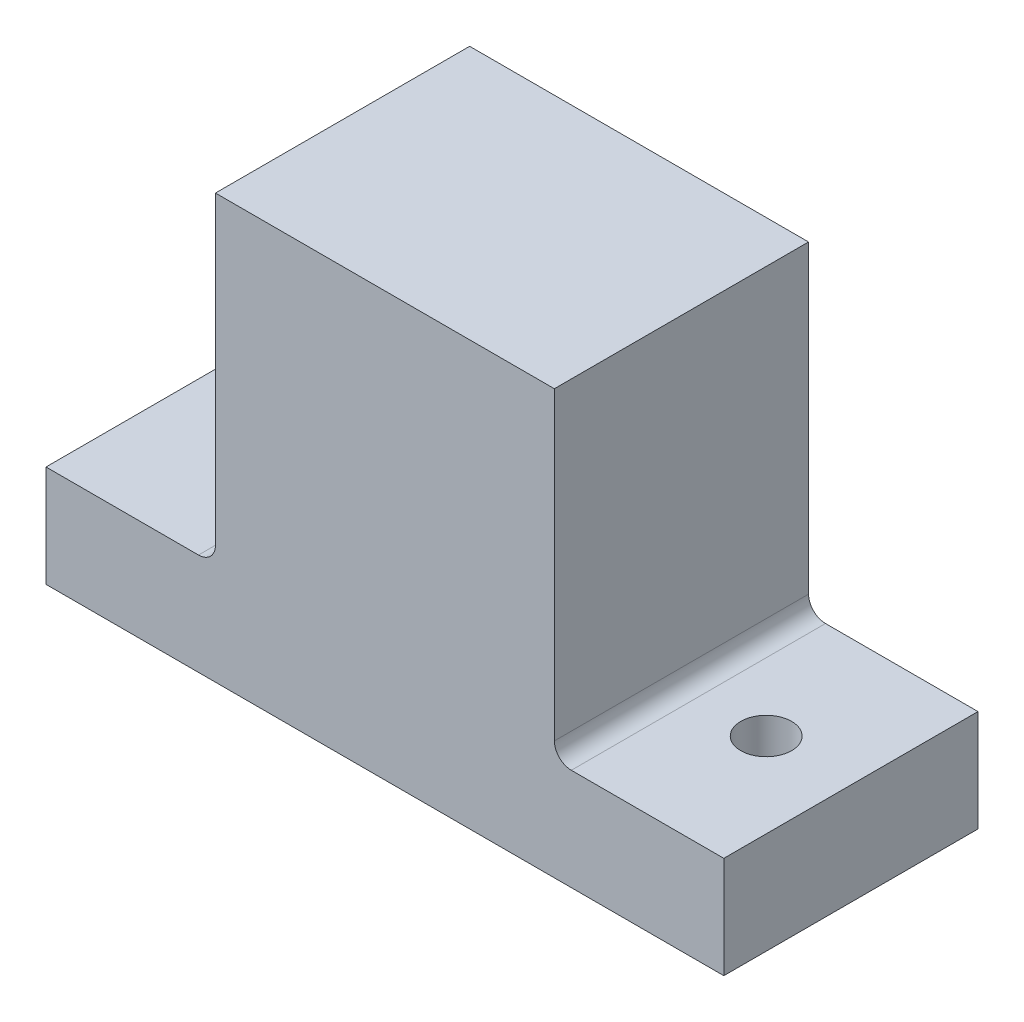
ISO-10303-21;
HEADER;
FILE_DESCRIPTION(('STEP AP214'),'2;1');
FILE_NAME('part.step','',(''),(''),'','','');
FILE_SCHEMA(('AUTOMOTIVE_DESIGN { 1 0 10303 214 1 1 1 1 }'));
ENDSEC;
DATA;
#1=APPLICATION_CONTEXT('core data for automotive mechanical design processes');
#2=APPLICATION_PROTOCOL_DEFINITION('international standard','automotive_design',2000,#1);
#3=PRODUCT_CONTEXT('',#1,'mechanical');
#4=PRODUCT('Part','Part','',(#3));
#5=PRODUCT_RELATED_PRODUCT_CATEGORY('part','',(#4));
#6=PRODUCT_DEFINITION_FORMATION('','',#4);
#7=PRODUCT_DEFINITION_CONTEXT('part definition',#1,'design');
#8=PRODUCT_DEFINITION('design','',#6,#7);
#9=PRODUCT_DEFINITION_SHAPE('','',#8);
#10=(LENGTH_UNIT() NAMED_UNIT(*) SI_UNIT(.MILLI.,.METRE.));
#11=(NAMED_UNIT(*) PLANE_ANGLE_UNIT() SI_UNIT($,.RADIAN.));
#12=(NAMED_UNIT(*) SI_UNIT($,.STERADIAN.) SOLID_ANGLE_UNIT());
#13=UNCERTAINTY_MEASURE_WITH_UNIT(LENGTH_MEASURE(1.E-05),#10,'distance_accuracy_value','');
#14=(GEOMETRIC_REPRESENTATION_CONTEXT(3) GLOBAL_UNCERTAINTY_ASSIGNED_CONTEXT((#13)) GLOBAL_UNIT_ASSIGNED_CONTEXT((#10,
#11,#12)) REPRESENTATION_CONTEXT('',''));
#15=CARTESIAN_POINT('',(0.,0.,0.));
#16=DIRECTION('',(0.,0.,1.));
#17=DIRECTION('',(1.,0.,0.));
#18=AXIS2_PLACEMENT_3D('',#15,#16,#17);
#19=CARTESIAN_POINT('',(-20.,0.,15.));
#20=DIRECTION('',(1.,0.,0.));
#21=DIRECTION('',(0.,0.,-1.));
#22=AXIS2_PLACEMENT_3D('',#19,#20,#21);
#23=PLANE('',#22);
#24=DIRECTION('',(0.,-1.,0.));
#25=VECTOR('',#24,1.);
#26=CARTESIAN_POINT('',(-20.,0.,0.));
#27=LINE('',#26,#25);
#28=CARTESIAN_POINT('',(-20.,6.,0.));
#29=VERTEX_POINT('',#28);
#30=CARTESIAN_POINT('',(-20.,0.,0.));
#31=VERTEX_POINT('',#30);
#32=EDGE_CURVE('E142',#29,#31,#27,.T.);
#33=ORIENTED_EDGE('',*,*,#32,.T.);
#34=DIRECTION('',(0.,0.,-1.));
#35=VECTOR('',#34,1.);
#36=CARTESIAN_POINT('',(-20.,0.,15.));
#37=LINE('',#36,#35);
#38=CARTESIAN_POINT('',(-20.,0.,15.));
#39=VERTEX_POINT('',#38);
#40=EDGE_CURVE('E121',#39,#31,#37,.T.);
#41=ORIENTED_EDGE('',*,*,#40,.F.);
#42=DIRECTION('',(0.,-1.,0.));
#43=VECTOR('',#42,1.);
#44=CARTESIAN_POINT('',(-20.,0.,15.));
#45=LINE('',#44,#43);
#46=CARTESIAN_POINT('',(-20.,6.,15.));
#47=VERTEX_POINT('',#46);
#48=EDGE_CURVE('E129',#47,#39,#45,.T.);
#49=ORIENTED_EDGE('',*,*,#48,.F.);
#50=DIRECTION('',(0.,0.,-1.));
#51=VECTOR('',#50,1.);
#52=CARTESIAN_POINT('',(-20.,6.,15.));
#53=LINE('',#52,#51);
#54=EDGE_CURVE('E218',#47,#29,#53,.T.);
#55=ORIENTED_EDGE('',*,*,#54,.T.);
#56=EDGE_LOOP('',(#33,#41,#49,#55));
#57=FACE_BOUND('',#56,.T.);
#58=ADVANCED_FACE('F39',(#57),#23,.F.);
#59=CARTESIAN_POINT('',(20.,0.,15.));
#60=DIRECTION('',(0.,1.,0.));
#61=DIRECTION('',(0.,0.,1.));
#62=AXIS2_PLACEMENT_3D('',#59,#60,#61);
#63=PLANE('',#62);
#64=CARTESIAN_POINT('',(-15.,0.,7.50000000000001));
#65=DIRECTION('',(0.,1.,0.));
#66=DIRECTION('',(-1.,0.,0.));
#67=AXIS2_PLACEMENT_3D('',#64,#65,#66);
#68=CIRCLE('',#67,1.5);
#69=CARTESIAN_POINT('',(-16.5,0.,7.50000000000001));
#70=VERTEX_POINT('',#69);
#71=EDGE_CURVE('E240',#70,#70,#68,.T.);
#72=ORIENTED_EDGE('',*,*,#71,.T.);
#73=EDGE_LOOP('',(#72));
#74=FACE_BOUND('',#73,.T.);
#75=CARTESIAN_POINT('',(15.,0.,7.50000000000001));
#76=DIRECTION('',(0.,1.,0.));
#77=DIRECTION('',(1.,0.,0.));
#78=AXIS2_PLACEMENT_3D('',#75,#76,#77);
#79=CIRCLE('',#78,1.5);
#80=CARTESIAN_POINT('',(16.5,0.,7.50000000000001));
#81=VERTEX_POINT('',#80);
#82=EDGE_CURVE('E377',#81,#81,#79,.T.);
#83=ORIENTED_EDGE('',*,*,#82,.T.);
#84=EDGE_LOOP('',(#83));
#85=FACE_BOUND('',#84,.T.);
#86=DIRECTION('',(1.,0.,0.));
#87=VECTOR('',#86,1.);
#88=CARTESIAN_POINT('',(20.,0.,0.));
#89=LINE('',#88,#87);
#90=CARTESIAN_POINT('',(20.,0.,0.));
#91=VERTEX_POINT('',#90);
#92=EDGE_CURVE('E207',#31,#91,#89,.T.);
#93=ORIENTED_EDGE('',*,*,#92,.T.);
#94=DIRECTION('',(0.,0.,-1.));
#95=VECTOR('',#94,1.);
#96=CARTESIAN_POINT('',(20.,0.,15.));
#97=LINE('',#96,#95);
#98=CARTESIAN_POINT('',(20.,0.,15.));
#99=VERTEX_POINT('',#98);
#100=EDGE_CURVE('E124',#99,#91,#97,.T.);
#101=ORIENTED_EDGE('',*,*,#100,.F.);
#102=DIRECTION('',(1.,0.,0.));
#103=VECTOR('',#102,1.);
#104=CARTESIAN_POINT('',(20.,0.,15.));
#105=LINE('',#104,#103);
#106=EDGE_CURVE('E117',#39,#99,#105,.T.);
#107=ORIENTED_EDGE('',*,*,#106,.F.);
#108=ORIENTED_EDGE('',*,*,#40,.T.);
#109=EDGE_LOOP('',(#93,#101,#107,#108));
#110=FACE_BOUND('',#109,.T.);
#111=ADVANCED_FACE('F119',(#74,#85,#110),#63,.F.);
#112=CARTESIAN_POINT('',(20.,0.,15.));
#113=DIRECTION('',(-1.,0.,0.));
#114=DIRECTION('',(0.,0.,1.));
#115=AXIS2_PLACEMENT_3D('',#112,#113,#114);
#116=PLANE('',#115);
#117=DIRECTION('',(0.,1.,0.));
#118=VECTOR('',#117,1.);
#119=CARTESIAN_POINT('',(20.,0.,0.));
#120=LINE('',#119,#118);
#121=CARTESIAN_POINT('',(20.,6.,0.));
#122=VERTEX_POINT('',#121);
#123=EDGE_CURVE('E201',#91,#122,#120,.T.);
#124=ORIENTED_EDGE('',*,*,#123,.T.);
#125=DIRECTION('',(0.,0.,-1.));
#126=VECTOR('',#125,1.);
#127=CARTESIAN_POINT('',(20.,6.,15.));
#128=LINE('',#127,#126);
#129=CARTESIAN_POINT('',(20.,6.,15.));
#130=VERTEX_POINT('',#129);
#131=EDGE_CURVE('E151',#130,#122,#128,.T.);
#132=ORIENTED_EDGE('',*,*,#131,.F.);
#133=DIRECTION('',(0.,1.,0.));
#134=VECTOR('',#133,1.);
#135=CARTESIAN_POINT('',(20.,0.,15.));
#136=LINE('',#135,#134);
#137=EDGE_CURVE('E128',#99,#130,#136,.T.);
#138=ORIENTED_EDGE('',*,*,#137,.F.);
#139=ORIENTED_EDGE('',*,*,#100,.T.);
#140=EDGE_LOOP('',(#124,#132,#138,#139));
#141=FACE_BOUND('',#140,.T.);
#142=ADVANCED_FACE('F243',(#141),#116,.F.);
#143=CARTESIAN_POINT('',(20.,6.,15.));
#144=DIRECTION('',(0.,-1.,0.));
#145=DIRECTION('',(1.,0.,0.));
#146=AXIS2_PLACEMENT_3D('',#143,#144,#145);
#147=PLANE('',#146);
#148=CARTESIAN_POINT('',(15.,5.99999999999999,7.50000000000001));
#149=DIRECTION('',(0.,1.,0.));
#150=DIRECTION('',(1.,0.,0.));
#151=AXIS2_PLACEMENT_3D('',#148,#149,#150);
#152=CIRCLE('',#151,1.5);
#153=CARTESIAN_POINT('',(16.5,5.99999999999999,7.50000000000001));
#154=VERTEX_POINT('',#153);
#155=EDGE_CURVE('E384',#154,#154,#152,.T.);
#156=ORIENTED_EDGE('',*,*,#155,.F.);
#157=EDGE_LOOP('',(#156));
#158=FACE_BOUND('',#157,.T.);
#159=DIRECTION('',(-1.,0.,0.));
#160=VECTOR('',#159,1.);
#161=CARTESIAN_POINT('',(20.,6.,0.));
#162=LINE('',#161,#160);
#163=CARTESIAN_POINT('',(11.,5.99999999999999,0.));
#164=VERTEX_POINT('',#163);
#165=EDGE_CURVE('E193',#122,#164,#162,.T.);
#166=ORIENTED_EDGE('',*,*,#165,.T.);
#167=DIRECTION('',(0.,0.,-1.));
#168=VECTOR('',#167,1.);
#169=CARTESIAN_POINT('',(11.,5.99999999999999,15.));
#170=LINE('',#169,#168);
#171=CARTESIAN_POINT('',(11.,5.99999999999999,15.));
#172=VERTEX_POINT('',#171);
#173=EDGE_CURVE('E149',#164,#172,#170,.F.);
#174=ORIENTED_EDGE('',*,*,#173,.T.);
#175=DIRECTION('',(-1.,0.,0.));
#176=VECTOR('',#175,1.);
#177=CARTESIAN_POINT('',(20.,6.,15.));
#178=LINE('',#177,#176);
#179=EDGE_CURVE('E175',#130,#172,#178,.T.);
#180=ORIENTED_EDGE('',*,*,#179,.F.);
#181=ORIENTED_EDGE('',*,*,#131,.T.);
#182=EDGE_LOOP('',(#166,#174,#180,#181));
#183=FACE_BOUND('',#182,.T.);
#184=ADVANCED_FACE('F198',(#158,#183),#147,.F.);
#185=CARTESIAN_POINT('',(10.,5.99999999999999,15.));
#186=DIRECTION('',(-1.,0.,0.));
#187=DIRECTION('',(0.,0.,1.));
#188=AXIS2_PLACEMENT_3D('',#185,#186,#187);
#189=PLANE('',#188);
#190=DIRECTION('',(0.,1.,0.));
#191=VECTOR('',#190,1.);
#192=CARTESIAN_POINT('',(10.,5.99999999999999,15.));
#193=LINE('',#192,#191);
#194=CARTESIAN_POINT('',(10.,6.99999999999999,15.));
#195=VERTEX_POINT('',#194);
#196=CARTESIAN_POINT('',(10.,25.,15.));
#197=VERTEX_POINT('',#196);
#198=EDGE_CURVE('E172',#195,#197,#193,.T.);
#199=ORIENTED_EDGE('',*,*,#198,.F.);
#200=DIRECTION('',(0.,0.,-1.));
#201=VECTOR('',#200,1.);
#202=CARTESIAN_POINT('',(10.,6.99999999999999,0.));
#203=LINE('',#202,#201);
#204=CARTESIAN_POINT('',(10.,6.99999999999999,0.));
#205=VERTEX_POINT('',#204);
#206=EDGE_CURVE('E144',#195,#205,#203,.T.);
#207=ORIENTED_EDGE('',*,*,#206,.T.);
#208=DIRECTION('',(0.,1.,0.));
#209=VECTOR('',#208,1.);
#210=CARTESIAN_POINT('',(10.,5.99999999999999,0.));
#211=LINE('',#210,#209);
#212=CARTESIAN_POINT('',(10.,25.,0.));
#213=VERTEX_POINT('',#212);
#214=EDGE_CURVE('E195',#205,#213,#211,.T.);
#215=ORIENTED_EDGE('',*,*,#214,.T.);
#216=DIRECTION('',(0.,0.,-1.));
#217=VECTOR('',#216,1.);
#218=CARTESIAN_POINT('',(10.,25.,15.));
#219=LINE('',#218,#217);
#220=EDGE_CURVE('E183',#197,#213,#219,.T.);
#221=ORIENTED_EDGE('',*,*,#220,.F.);
#222=EDGE_LOOP('',(#199,#207,#215,#221));
#223=FACE_BOUND('',#222,.T.);
#224=ADVANCED_FACE('F180',(#223),#189,.F.);
#225=CARTESIAN_POINT('',(-10.,25.,15.));
#226=DIRECTION('',(0.,-1.,0.));
#227=DIRECTION('',(0.,0.,-1.));
#228=AXIS2_PLACEMENT_3D('',#225,#226,#227);
#229=PLANE('',#228);
#230=DIRECTION('',(-1.,0.,0.));
#231=VECTOR('',#230,1.);
#232=CARTESIAN_POINT('',(-10.,25.,0.));
#233=LINE('',#232,#231);
#234=CARTESIAN_POINT('',(-10.,25.,0.));
#235=VERTEX_POINT('',#234);
#236=EDGE_CURVE('E205',#213,#235,#233,.T.);
#237=ORIENTED_EDGE('',*,*,#236,.T.);
#238=DIRECTION('',(0.,0.,-1.));
#239=VECTOR('',#238,1.);
#240=CARTESIAN_POINT('',(-10.,25.,15.));
#241=LINE('',#240,#239);
#242=CARTESIAN_POINT('',(-10.,25.,15.));
#243=VERTEX_POINT('',#242);
#244=EDGE_CURVE('E221',#243,#235,#241,.T.);
#245=ORIENTED_EDGE('',*,*,#244,.F.);
#246=DIRECTION('',(-1.,0.,0.));
#247=VECTOR('',#246,1.);
#248=CARTESIAN_POINT('',(-10.,25.,15.));
#249=LINE('',#248,#247);
#250=EDGE_CURVE('E186',#197,#243,#249,.T.);
#251=ORIENTED_EDGE('',*,*,#250,.F.);
#252=ORIENTED_EDGE('',*,*,#220,.T.);
#253=EDGE_LOOP('',(#237,#245,#251,#252));
#254=FACE_BOUND('',#253,.T.);
#255=ADVANCED_FACE('F287',(#254),#229,.F.);
#256=CARTESIAN_POINT('',(-10.,5.99999999999999,15.));
#257=DIRECTION('',(1.,0.,0.));
#258=DIRECTION('',(0.,0.,-1.));
#259=AXIS2_PLACEMENT_3D('',#256,#257,#258);
#260=PLANE('',#259);
#261=DIRECTION('',(0.,-1.,0.));
#262=VECTOR('',#261,1.);
#263=CARTESIAN_POINT('',(-10.,5.99999999999999,0.));
#264=LINE('',#263,#262);
#265=CARTESIAN_POINT('',(-10.,6.99999999999999,0.));
#266=VERTEX_POINT('',#265);
#267=EDGE_CURVE('E213',#235,#266,#264,.T.);
#268=ORIENTED_EDGE('',*,*,#267,.T.);
#269=DIRECTION('',(0.,0.,-1.));
#270=VECTOR('',#269,1.);
#271=CARTESIAN_POINT('',(-10.,6.99999999999999,15.));
#272=LINE('',#271,#270);
#273=CARTESIAN_POINT('',(-10.,6.99999999999999,15.));
#274=VERTEX_POINT('',#273);
#275=EDGE_CURVE('E55',#266,#274,#272,.F.);
#276=ORIENTED_EDGE('',*,*,#275,.T.);
#277=DIRECTION('',(0.,-1.,0.));
#278=VECTOR('',#277,1.);
#279=CARTESIAN_POINT('',(-10.,5.99999999999999,15.));
#280=LINE('',#279,#278);
#281=EDGE_CURVE('E229',#243,#274,#280,.T.);
#282=ORIENTED_EDGE('',*,*,#281,.F.);
#283=ORIENTED_EDGE('',*,*,#244,.T.);
#284=EDGE_LOOP('',(#268,#276,#282,#283));
#285=FACE_BOUND('',#284,.T.);
#286=ADVANCED_FACE('F283',(#285),#260,.F.);
#287=CARTESIAN_POINT('',(-20.,6.,15.));
#288=DIRECTION('',(0.,-1.,0.));
#289=DIRECTION('',(1.,0.,0.));
#290=AXIS2_PLACEMENT_3D('',#287,#288,#289);
#291=PLANE('',#290);
#292=CARTESIAN_POINT('',(-15.,6.,7.50000000000001));
#293=DIRECTION('',(0.,1.,0.));
#294=DIRECTION('',(-1.,0.,0.));
#295=AXIS2_PLACEMENT_3D('',#292,#293,#294);
#296=CIRCLE('',#295,1.5);
#297=CARTESIAN_POINT('',(-16.5,6.,7.50000000000001));
#298=VERTEX_POINT('',#297);
#299=EDGE_CURVE('E374',#298,#298,#296,.T.);
#300=ORIENTED_EDGE('',*,*,#299,.F.);
#301=EDGE_LOOP('',(#300));
#302=FACE_BOUND('',#301,.T.);
#303=DIRECTION('',(-1.,0.,0.));
#304=VECTOR('',#303,1.);
#305=CARTESIAN_POINT('',(-20.,6.,15.));
#306=LINE('',#305,#304);
#307=CARTESIAN_POINT('',(-11.,5.99999999999999,15.));
#308=VERTEX_POINT('',#307);
#309=EDGE_CURVE('E134',#308,#47,#306,.T.);
#310=ORIENTED_EDGE('',*,*,#309,.F.);
#311=DIRECTION('',(0.,0.,-1.));
#312=VECTOR('',#311,1.);
#313=CARTESIAN_POINT('',(-11.,5.99999999999999,0.));
#314=LINE('',#313,#312);
#315=CARTESIAN_POINT('',(-11.,5.99999999999999,0.));
#316=VERTEX_POINT('',#315);
#317=EDGE_CURVE('E157',#308,#316,#314,.T.);
#318=ORIENTED_EDGE('',*,*,#317,.T.);
#319=DIRECTION('',(-1.,0.,0.));
#320=VECTOR('',#319,1.);
#321=CARTESIAN_POINT('',(-20.,6.,0.));
#322=LINE('',#321,#320);
#323=EDGE_CURVE('E139',#316,#29,#322,.T.);
#324=ORIENTED_EDGE('',*,*,#323,.T.);
#325=ORIENTED_EDGE('',*,*,#54,.F.);
#326=EDGE_LOOP('',(#310,#318,#324,#325));
#327=FACE_BOUND('',#326,.T.);
#328=ADVANCED_FACE('F278',(#302,#327),#291,.F.);
#329=CARTESIAN_POINT('',(0.,0.,15.));
#330=DIRECTION('',(0.,0.,-1.));
#331=DIRECTION('',(-1.,0.,0.));
#332=AXIS2_PLACEMENT_3D('',#329,#330,#331);
#333=PLANE('',#332);
#334=ORIENTED_EDGE('',*,*,#48,.T.);
#335=ORIENTED_EDGE('',*,*,#106,.T.);
#336=ORIENTED_EDGE('',*,*,#137,.T.);
#337=ORIENTED_EDGE('',*,*,#179,.T.);
#338=CARTESIAN_POINT('',(11.,6.99999999999999,15.));
#339=DIRECTION('',(0.,0.,-1.));
#340=DIRECTION('',(-1.,0.,0.));
#341=AXIS2_PLACEMENT_3D('',#338,#339,#340);
#342=CIRCLE('',#341,1.);
#343=EDGE_CURVE('E166',#172,#195,#342,.T.);
#344=ORIENTED_EDGE('',*,*,#343,.T.);
#345=ORIENTED_EDGE('',*,*,#198,.T.);
#346=ORIENTED_EDGE('',*,*,#250,.T.);
#347=ORIENTED_EDGE('',*,*,#281,.T.);
#348=CARTESIAN_POINT('',(-11.,6.99999999999999,15.));
#349=DIRECTION('',(0.,0.,-1.));
#350=DIRECTION('',(-1.,0.,0.));
#351=AXIS2_PLACEMENT_3D('',#348,#349,#350);
#352=CIRCLE('',#351,1.);
#353=EDGE_CURVE('E11',#274,#308,#352,.T.);
#354=ORIENTED_EDGE('',*,*,#353,.T.);
#355=ORIENTED_EDGE('',*,*,#309,.T.);
#356=EDGE_LOOP('',(#334,#335,#336,#337,#344,#345,#346,#347,#354,#355));
#357=FACE_BOUND('',#356,.T.);
#358=ADVANCED_FACE('F132',(#357),#333,.F.);
#359=CARTESIAN_POINT('',(0.,0.,0.));
#360=DIRECTION('',(0.,0.,-1.));
#361=DIRECTION('',(-1.,0.,0.));
#362=AXIS2_PLACEMENT_3D('',#359,#360,#361);
#363=PLANE('',#362);
#364=ORIENTED_EDGE('',*,*,#32,.F.);
#365=ORIENTED_EDGE('',*,*,#323,.F.);
#366=CARTESIAN_POINT('',(-11.,6.99999999999999,0.));
#367=DIRECTION('',(0.,0.,-1.));
#368=DIRECTION('',(-1.,0.,0.));
#369=AXIS2_PLACEMENT_3D('',#366,#367,#368);
#370=CIRCLE('',#369,1.);
#371=EDGE_CURVE('E48',#316,#266,#370,.F.);
#372=ORIENTED_EDGE('',*,*,#371,.T.);
#373=ORIENTED_EDGE('',*,*,#267,.F.);
#374=ORIENTED_EDGE('',*,*,#236,.F.);
#375=ORIENTED_EDGE('',*,*,#214,.F.);
#376=CARTESIAN_POINT('',(11.,6.99999999999999,0.));
#377=DIRECTION('',(0.,0.,-1.));
#378=DIRECTION('',(-1.,0.,0.));
#379=AXIS2_PLACEMENT_3D('',#376,#377,#378);
#380=CIRCLE('',#379,1.);
#381=EDGE_CURVE('E163',#205,#164,#380,.F.);
#382=ORIENTED_EDGE('',*,*,#381,.T.);
#383=ORIENTED_EDGE('',*,*,#165,.F.);
#384=ORIENTED_EDGE('',*,*,#123,.F.);
#385=ORIENTED_EDGE('',*,*,#92,.F.);
#386=EDGE_LOOP('',(#364,#365,#372,#373,#374,#375,#382,#383,#384,#385));
#387=FACE_BOUND('',#386,.T.);
#388=ADVANCED_FACE('F191',(#387),#363,.T.);
#389=CARTESIAN_POINT('',(-15.,0.,7.50000000000001));
#390=DIRECTION('',(0.,1.,0.));
#391=DIRECTION('',(-1.,0.,0.));
#392=AXIS2_PLACEMENT_3D('',#389,#390,#391);
#393=CYLINDRICAL_SURFACE('',#392,1.5);
#394=ORIENTED_EDGE('',*,*,#71,.F.);
#395=EDGE_LOOP('',(#394));
#396=FACE_BOUND('',#395,.T.);
#397=ORIENTED_EDGE('',*,*,#299,.T.);
#398=EDGE_LOOP('',(#397));
#399=FACE_BOUND('',#398,.T.);
#400=ADVANCED_FACE('F265',(#396,#399),#393,.F.);
#401=CARTESIAN_POINT('',(15.,0.,7.50000000000001));
#402=DIRECTION('',(0.,1.,0.));
#403=DIRECTION('',(-1.,0.,0.));
#404=AXIS2_PLACEMENT_3D('',#401,#402,#403);
#405=CYLINDRICAL_SURFACE('',#404,1.5);
#406=ORIENTED_EDGE('',*,*,#82,.F.);
#407=EDGE_LOOP('',(#406));
#408=FACE_BOUND('',#407,.T.);
#409=ORIENTED_EDGE('',*,*,#155,.T.);
#410=EDGE_LOOP('',(#409));
#411=FACE_BOUND('',#410,.T.);
#412=ADVANCED_FACE('F259',(#408,#411),#405,.F.);
#413=CARTESIAN_POINT('',(11.,6.99999999999999,15.));
#414=DIRECTION('',(0.,0.,1.));
#415=DIRECTION('',(1.,0.,0.));
#416=AXIS2_PLACEMENT_3D('',#413,#414,#415);
#417=CYLINDRICAL_SURFACE('',#416,1.);
#418=ORIENTED_EDGE('',*,*,#343,.F.);
#419=ORIENTED_EDGE('',*,*,#173,.F.);
#420=ORIENTED_EDGE('',*,*,#381,.F.);
#421=ORIENTED_EDGE('',*,*,#206,.F.);
#422=EDGE_LOOP('',(#418,#419,#420,#421));
#423=FACE_BOUND('',#422,.T.);
#424=ADVANCED_FACE('F188',(#423),#417,.F.);
#425=CARTESIAN_POINT('',(-11.,6.99999999999999,15.));
#426=DIRECTION('',(0.,0.,1.));
#427=DIRECTION('',(1.,0.,0.));
#428=AXIS2_PLACEMENT_3D('',#425,#426,#427);
#429=CYLINDRICAL_SURFACE('',#428,1.);
#430=ORIENTED_EDGE('',*,*,#353,.F.);
#431=ORIENTED_EDGE('',*,*,#275,.F.);
#432=ORIENTED_EDGE('',*,*,#371,.F.);
#433=ORIENTED_EDGE('',*,*,#317,.F.);
#434=EDGE_LOOP('',(#430,#431,#432,#433));
#435=FACE_BOUND('',#434,.T.);
#436=ADVANCED_FACE('F41',(#435),#429,.F.);
#437=CLOSED_SHELL('',(#58,#111,#142,#184,#224,#255,#286,#328,#358,#388,#400,#412,#424,#436));
#438=MANIFOLD_SOLID_BREP('B2',#437);
#439=ADVANCED_BREP_SHAPE_REPRESENTATION('',(#18,#438),#14);
#440=SHAPE_DEFINITION_REPRESENTATION(#9,#439);
ENDSEC;
END-ISO-10303-21;
